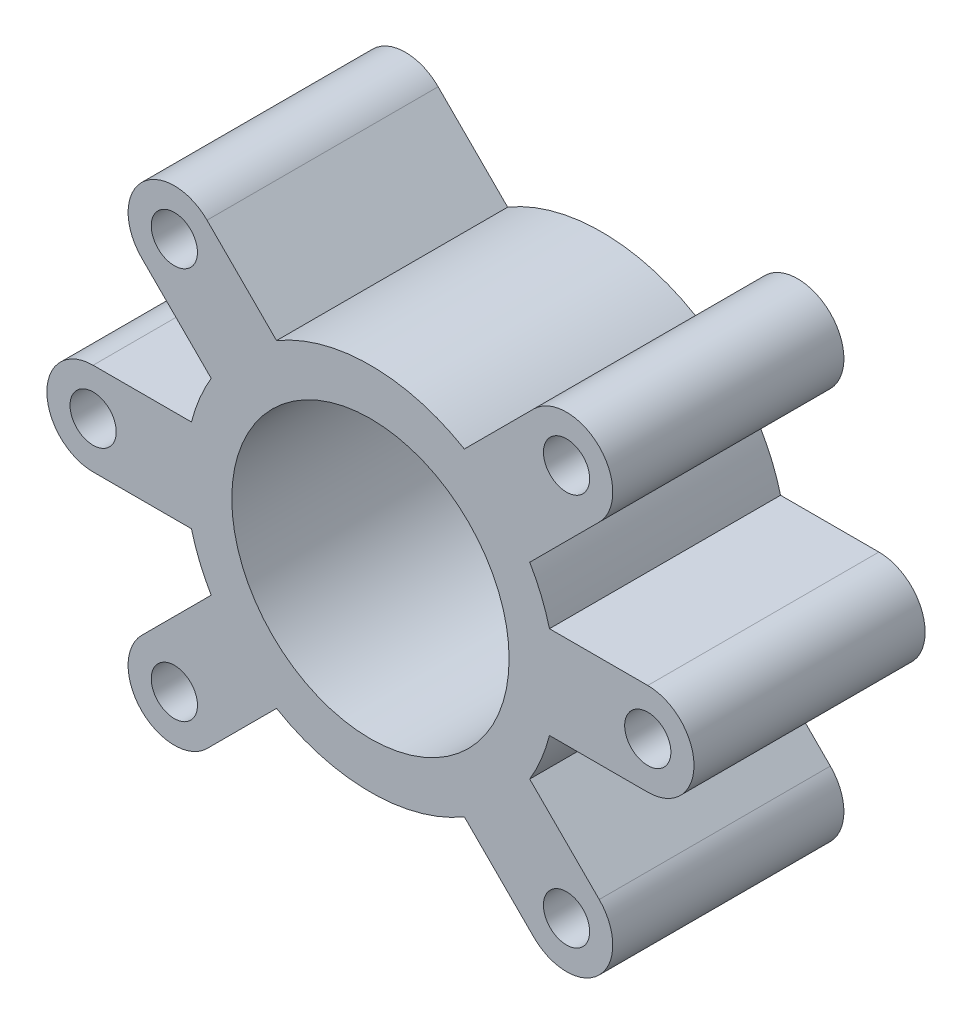
ISO-10303-21;
HEADER;
FILE_DESCRIPTION(('STEP AP214'),'2;1');
FILE_NAME('part.step','',(''),(''),'','','');
FILE_SCHEMA(('AUTOMOTIVE_DESIGN { 1 0 10303 214 1 1 1 1 }'));
ENDSEC;
DATA;
#1=APPLICATION_CONTEXT('core data for automotive mechanical design processes');
#2=APPLICATION_PROTOCOL_DEFINITION('international standard','automotive_design',2000,#1);
#3=PRODUCT_CONTEXT('',#1,'mechanical');
#4=PRODUCT('Part','Part','',(#3));
#5=PRODUCT_RELATED_PRODUCT_CATEGORY('part','',(#4));
#6=PRODUCT_DEFINITION_FORMATION('','',#4);
#7=PRODUCT_DEFINITION_CONTEXT('part definition',#1,'design');
#8=PRODUCT_DEFINITION('design','',#6,#7);
#9=PRODUCT_DEFINITION_SHAPE('','',#8);
#10=(LENGTH_UNIT() NAMED_UNIT(*) SI_UNIT(.MILLI.,.METRE.));
#11=(NAMED_UNIT(*) PLANE_ANGLE_UNIT() SI_UNIT($,.RADIAN.));
#12=(NAMED_UNIT(*) SI_UNIT($,.STERADIAN.) SOLID_ANGLE_UNIT());
#13=UNCERTAINTY_MEASURE_WITH_UNIT(LENGTH_MEASURE(1.E-05),#10,'distance_accuracy_value','');
#14=(GEOMETRIC_REPRESENTATION_CONTEXT(3) GLOBAL_UNCERTAINTY_ASSIGNED_CONTEXT((#13)) GLOBAL_UNIT_ASSIGNED_CONTEXT((#10,
#11,#12)) REPRESENTATION_CONTEXT('',''));
#15=CARTESIAN_POINT('',(0.,0.,0.));
#16=DIRECTION('',(0.,0.,1.));
#17=DIRECTION('',(1.,0.,0.));
#18=AXIS2_PLACEMENT_3D('',#15,#16,#17);
#19=CARTESIAN_POINT('',(0.,0.,50.));
#20=DIRECTION('',(0.,0.,-1.));
#21=DIRECTION('',(-1.,0.,0.));
#22=AXIS2_PLACEMENT_3D('',#19,#20,#21);
#23=CYLINDRICAL_SURFACE('',#22,40.);
#24=CARTESIAN_POINT('',(0.,0.,0.));
#25=DIRECTION('',(0.,0.,1.));
#26=DIRECTION('',(1.,0.,0.));
#27=AXIS2_PLACEMENT_3D('',#24,#25,#26);
#28=CIRCLE('',#27,40.);
#29=CARTESIAN_POINT('',(38.7298334620742,10.,0.));
#30=VERTEX_POINT('',#29);
#31=CARTESIAN_POINT('',(34.457195687124,20.3150600633924,0.));
#32=VERTEX_POINT('',#31);
#33=EDGE_CURVE('E251',#30,#32,#28,.T.);
#34=ORIENTED_EDGE('',*,*,#33,.T.);
#35=DIRECTION('',(0.,0.,-1.));
#36=VECTOR('',#35,1.);
#37=CARTESIAN_POINT('',(34.457195687124,20.3150600633924,50.));
#38=LINE('',#37,#36);
#39=CARTESIAN_POINT('',(34.457195687124,20.3150600633924,50.));
#40=VERTEX_POINT('',#39);
#41=EDGE_CURVE('E11',#40,#32,#38,.T.);
#42=ORIENTED_EDGE('',*,*,#41,.F.);
#43=CARTESIAN_POINT('',(0.,0.,50.));
#44=DIRECTION('',(0.,0.,1.));
#45=DIRECTION('',(1.,0.,0.));
#46=AXIS2_PLACEMENT_3D('',#43,#44,#45);
#47=CIRCLE('',#46,40.);
#48=CARTESIAN_POINT('',(38.7298334620742,10.,50.));
#49=VERTEX_POINT('',#48);
#50=EDGE_CURVE('E139',#49,#40,#47,.T.);
#51=ORIENTED_EDGE('',*,*,#50,.F.);
#52=DIRECTION('',(0.,0.,-1.));
#53=VECTOR('',#52,1.);
#54=CARTESIAN_POINT('',(38.7298334620742,10.,50.));
#55=LINE('',#54,#53);
#56=EDGE_CURVE('E54',#49,#30,#55,.T.);
#57=ORIENTED_EDGE('',*,*,#56,.T.);
#58=EDGE_LOOP('',(#34,#42,#51,#57));
#59=FACE_BOUND('',#58,.T.);
#60=ADVANCED_FACE('F37',(#59),#23,.T.);
#61=CARTESIAN_POINT('',(7.0710678118654,-7.07106781186557,50.));
#62=DIRECTION('',(0.707106781186539,-0.707106781186556,0.));
#63=DIRECTION('',(0.707106781186556,0.707106781186539,0.));
#64=AXIS2_PLACEMENT_3D('',#61,#62,#63);
#65=PLANE('',#64);
#66=DIRECTION('',(-0.707106781186556,-0.707106781186539,0.));
#67=VECTOR('',#66,1.);
#68=CARTESIAN_POINT('',(7.0710678118654,-7.07106781186557,0.));
#69=LINE('',#68,#67);
#70=CARTESIAN_POINT('',(49.4974746830588,35.3553390593268,0.));
#71=VERTEX_POINT('',#70);
#72=EDGE_CURVE('E253',#71,#32,#69,.T.);
#73=ORIENTED_EDGE('',*,*,#72,.F.);
#74=DIRECTION('',(0.,0.,-1.));
#75=VECTOR('',#74,1.);
#76=CARTESIAN_POINT('',(49.4974746830588,35.3553390593268,50.));
#77=LINE('',#76,#75);
#78=CARTESIAN_POINT('',(49.4974746830588,35.3553390593268,50.));
#79=VERTEX_POINT('',#78);
#80=EDGE_CURVE('E46',#79,#71,#77,.T.);
#81=ORIENTED_EDGE('',*,*,#80,.F.);
#82=DIRECTION('',(-0.707106781186556,-0.707106781186539,0.));
#83=VECTOR('',#82,1.);
#84=CARTESIAN_POINT('',(7.0710678118654,-7.07106781186557,50.));
#85=LINE('',#84,#83);
#86=EDGE_CURVE('E388',#79,#40,#85,.T.);
#87=ORIENTED_EDGE('',*,*,#86,.T.);
#88=ORIENTED_EDGE('',*,*,#41,.T.);
#89=EDGE_LOOP('',(#73,#81,#87,#88));
#90=FACE_BOUND('',#89,.T.);
#91=ADVANCED_FACE('F375',(#90),#65,.T.);
#92=CARTESIAN_POINT('',(42.4264068711934,42.4264068711923,50.));
#93=DIRECTION('',(0.,0.,-1.));
#94=DIRECTION('',(-1.,0.,0.));
#95=AXIS2_PLACEMENT_3D('',#92,#93,#94);
#96=CYLINDRICAL_SURFACE('',#95,10.);
#97=CARTESIAN_POINT('',(42.4264068711934,42.4264068711923,0.));
#98=DIRECTION('',(0.,0.,1.));
#99=DIRECTION('',(1.,0.,0.));
#100=AXIS2_PLACEMENT_3D('',#97,#98,#99);
#101=CIRCLE('',#100,10.);
#102=CARTESIAN_POINT('',(35.355339059328,49.4974746830579,0.));
#103=VERTEX_POINT('',#102);
#104=EDGE_CURVE('E258',#103,#71,#101,.F.);
#105=ORIENTED_EDGE('',*,*,#104,.F.);
#106=DIRECTION('',(0.,0.,-1.));
#107=VECTOR('',#106,1.);
#108=CARTESIAN_POINT('',(35.355339059328,49.4974746830579,50.));
#109=LINE('',#108,#107);
#110=CARTESIAN_POINT('',(35.355339059328,49.4974746830579,50.));
#111=VERTEX_POINT('',#110);
#112=EDGE_CURVE('E365',#111,#103,#109,.T.);
#113=ORIENTED_EDGE('',*,*,#112,.F.);
#114=CARTESIAN_POINT('',(42.4264068711934,42.4264068711923,50.));
#115=DIRECTION('',(0.,0.,1.));
#116=DIRECTION('',(1.,0.,0.));
#117=AXIS2_PLACEMENT_3D('',#114,#115,#116);
#118=CIRCLE('',#117,10.);
#119=EDGE_CURVE('E372',#111,#79,#118,.F.);
#120=ORIENTED_EDGE('',*,*,#119,.T.);
#121=ORIENTED_EDGE('',*,*,#80,.T.);
#122=EDGE_LOOP('',(#105,#113,#120,#121));
#123=FACE_BOUND('',#122,.T.);
#124=ADVANCED_FACE('F370',(#123),#96,.T.);
#125=CARTESIAN_POINT('',(-7.07106781186559,7.07106781186585,50.));
#126=DIRECTION('',(-0.707106781186535,0.70710678118656,0.));
#127=DIRECTION('',(-0.70710678118656,-0.707106781186535,0.));
#128=AXIS2_PLACEMENT_3D('',#125,#126,#127);
#129=PLANE('',#128);
#130=DIRECTION('',(0.70710678118656,0.707106781186535,0.));
#131=VECTOR('',#130,1.);
#132=CARTESIAN_POINT('',(-7.07106781186559,7.07106781186585,0.));
#133=LINE('',#132,#131);
#134=CARTESIAN_POINT('',(20.3150600633923,34.4571956871231,0.));
#135=VERTEX_POINT('',#134);
#136=EDGE_CURVE('E261',#135,#103,#133,.T.);
#137=ORIENTED_EDGE('',*,*,#136,.F.);
#138=DIRECTION('',(0.,0.,-1.));
#139=VECTOR('',#138,1.);
#140=CARTESIAN_POINT('',(20.3150600633923,34.4571956871231,50.));
#141=LINE('',#140,#139);
#142=CARTESIAN_POINT('',(20.3150600633923,34.4571956871231,50.));
#143=VERTEX_POINT('',#142);
#144=EDGE_CURVE('E363',#143,#135,#141,.T.);
#145=ORIENTED_EDGE('',*,*,#144,.F.);
#146=DIRECTION('',(0.70710678118656,0.707106781186535,0.));
#147=VECTOR('',#146,1.);
#148=CARTESIAN_POINT('',(-7.07106781186559,7.07106781186585,50.));
#149=LINE('',#148,#147);
#150=EDGE_CURVE('E387',#143,#111,#149,.T.);
#151=ORIENTED_EDGE('',*,*,#150,.T.);
#152=ORIENTED_EDGE('',*,*,#112,.T.);
#153=EDGE_LOOP('',(#137,#145,#151,#152));
#154=FACE_BOUND('',#153,.T.);
#155=ADVANCED_FACE('F383',(#154),#129,.T.);
#156=CARTESIAN_POINT('',(-20.315060063393,34.4571956871215,0.));
#157=VERTEX_POINT('',#156);
#158=EDGE_CURVE('E255',#135,#157,#28,.T.);
#159=ORIENTED_EDGE('',*,*,#158,.T.);
#160=DIRECTION('',(0.,0.,-1.));
#161=VECTOR('',#160,1.);
#162=CARTESIAN_POINT('',(-20.315060063393,34.4571956871215,50.));
#163=LINE('',#162,#161);
#164=CARTESIAN_POINT('',(-20.315060063393,34.4571956871215,50.));
#165=VERTEX_POINT('',#164);
#166=EDGE_CURVE('E361',#165,#157,#163,.T.);
#167=ORIENTED_EDGE('',*,*,#166,.F.);
#168=EDGE_CURVE('E390',#143,#165,#47,.T.);
#169=ORIENTED_EDGE('',*,*,#168,.F.);
#170=ORIENTED_EDGE('',*,*,#144,.T.);
#171=EDGE_LOOP('',(#159,#167,#169,#170));
#172=FACE_BOUND('',#171,.T.);
#173=ADVANCED_FACE('F483',(#172),#23,.T.);
#174=CARTESIAN_POINT('',(7.07106781186388,7.07106781186386,50.));
#175=DIRECTION('',(0.707106781186548,0.707106781186547,0.));
#176=DIRECTION('',(-0.707106781186547,0.707106781186548,0.));
#177=AXIS2_PLACEMENT_3D('',#174,#175,#176);
#178=PLANE('',#177);
#179=DIRECTION('',(0.707106781186547,-0.707106781186548,0.));
#180=VECTOR('',#179,1.);
#181=CARTESIAN_POINT('',(7.07106781186388,7.07106781186386,0.));
#182=LINE('',#181,#180);
#183=CARTESIAN_POINT('',(-35.3553390593272,49.4974746830551,0.));
#184=VERTEX_POINT('',#183);
#185=EDGE_CURVE('E264',#184,#157,#182,.T.);
#186=ORIENTED_EDGE('',*,*,#185,.F.);
#187=DIRECTION('',(0.,0.,-1.));
#188=VECTOR('',#187,1.);
#189=CARTESIAN_POINT('',(-35.3553390593272,49.4974746830551,50.));
#190=LINE('',#189,#188);
#191=CARTESIAN_POINT('',(-35.3553390593272,49.4974746830551,50.));
#192=VERTEX_POINT('',#191);
#193=EDGE_CURVE('E359',#192,#184,#190,.T.);
#194=ORIENTED_EDGE('',*,*,#193,.F.);
#195=DIRECTION('',(0.707106781186547,-0.707106781186548,0.));
#196=VECTOR('',#195,1.);
#197=CARTESIAN_POINT('',(7.07106781186388,7.07106781186386,50.));
#198=LINE('',#197,#196);
#199=EDGE_CURVE('E395',#192,#165,#198,.T.);
#200=ORIENTED_EDGE('',*,*,#199,.T.);
#201=ORIENTED_EDGE('',*,*,#166,.T.);
#202=EDGE_LOOP('',(#186,#194,#200,#201));
#203=FACE_BOUND('',#202,.T.);
#204=ADVANCED_FACE('F487',(#203),#178,.T.);
#205=CARTESIAN_POINT('',(-42.4264068711927,42.4264068711896,50.));
#206=DIRECTION('',(0.,0.,-1.));
#207=DIRECTION('',(-1.,0.,0.));
#208=AXIS2_PLACEMENT_3D('',#205,#206,#207);
#209=CYLINDRICAL_SURFACE('',#208,9.99999999999998);
#210=CARTESIAN_POINT('',(-42.4264068711927,42.4264068711896,0.));
#211=DIRECTION('',(0.,0.,1.));
#212=DIRECTION('',(1.,0.,0.));
#213=AXIS2_PLACEMENT_3D('',#210,#211,#212);
#214=CIRCLE('',#213,9.99999999999998);
#215=CARTESIAN_POINT('',(-49.4974746830582,35.3553390593242,0.));
#216=VERTEX_POINT('',#215);
#217=EDGE_CURVE('E267',#216,#184,#214,.F.);
#218=ORIENTED_EDGE('',*,*,#217,.F.);
#219=DIRECTION('',(0.,0.,-1.));
#220=VECTOR('',#219,1.);
#221=CARTESIAN_POINT('',(-49.4974746830582,35.3553390593242,50.));
#222=LINE('',#221,#220);
#223=CARTESIAN_POINT('',(-49.4974746830582,35.3553390593242,50.));
#224=VERTEX_POINT('',#223);
#225=EDGE_CURVE('E357',#224,#216,#222,.T.);
#226=ORIENTED_EDGE('',*,*,#225,.F.);
#227=CARTESIAN_POINT('',(-42.4264068711927,42.4264068711896,50.));
#228=DIRECTION('',(0.,0.,1.));
#229=DIRECTION('',(1.,0.,0.));
#230=AXIS2_PLACEMENT_3D('',#227,#228,#229);
#231=CIRCLE('',#230,9.99999999999998);
#232=EDGE_CURVE('E398',#224,#192,#231,.F.);
#233=ORIENTED_EDGE('',*,*,#232,.T.);
#234=ORIENTED_EDGE('',*,*,#193,.T.);
#235=EDGE_LOOP('',(#218,#226,#233,#234));
#236=FACE_BOUND('',#235,.T.);
#237=ADVANCED_FACE('F490',(#236),#209,.T.);
#238=CARTESIAN_POINT('',(-7.07106781186715,-7.07106781186711,50.));
#239=DIRECTION('',(-0.70710678118655,-0.707106781186545,0.));
#240=DIRECTION('',(0.707106781186545,-0.70710678118655,0.));
#241=AXIS2_PLACEMENT_3D('',#238,#239,#240);
#242=PLANE('',#241);
#243=DIRECTION('',(-0.707106781186545,0.70710678118655,0.));
#244=VECTOR('',#243,1.);
#245=CARTESIAN_POINT('',(-7.07106781186715,-7.07106781186711,0.));
#246=LINE('',#245,#244);
#247=CARTESIAN_POINT('',(-34.4571956871241,20.3150600633895,0.));
#248=VERTEX_POINT('',#247);
#249=EDGE_CURVE('E270',#248,#216,#246,.T.);
#250=ORIENTED_EDGE('',*,*,#249,.F.);
#251=DIRECTION('',(0.,0.,-1.));
#252=VECTOR('',#251,1.);
#253=CARTESIAN_POINT('',(-34.4571956871241,20.3150600633895,50.));
#254=LINE('',#253,#252);
#255=CARTESIAN_POINT('',(-34.4571956871241,20.3150600633895,50.));
#256=VERTEX_POINT('',#255);
#257=EDGE_CURVE('E355',#256,#248,#254,.T.);
#258=ORIENTED_EDGE('',*,*,#257,.F.);
#259=DIRECTION('',(-0.707106781186545,0.70710678118655,0.));
#260=VECTOR('',#259,1.);
#261=CARTESIAN_POINT('',(-7.07106781186715,-7.07106781186711,50.));
#262=LINE('',#261,#260);
#263=EDGE_CURVE('E401',#256,#224,#262,.T.);
#264=ORIENTED_EDGE('',*,*,#263,.T.);
#265=ORIENTED_EDGE('',*,*,#225,.T.);
#266=EDGE_LOOP('',(#250,#258,#264,#265));
#267=FACE_BOUND('',#266,.T.);
#268=ADVANCED_FACE('F493',(#267),#242,.T.);
#269=CARTESIAN_POINT('',(-38.7298334620733,9.99999999999677,0.));
#270=VERTEX_POINT('',#269);
#271=EDGE_CURVE('E273',#248,#270,#28,.T.);
#272=ORIENTED_EDGE('',*,*,#271,.T.);
#273=DIRECTION('',(0.,0.,-1.));
#274=VECTOR('',#273,1.);
#275=CARTESIAN_POINT('',(-38.7298334620733,9.99999999999677,50.));
#276=LINE('',#275,#274);
#277=CARTESIAN_POINT('',(-38.7298334620733,9.99999999999677,50.));
#278=VERTEX_POINT('',#277);
#279=EDGE_CURVE('E353',#278,#270,#276,.T.);
#280=ORIENTED_EDGE('',*,*,#279,.F.);
#281=EDGE_CURVE('E404',#256,#278,#47,.T.);
#282=ORIENTED_EDGE('',*,*,#281,.F.);
#283=ORIENTED_EDGE('',*,*,#257,.T.);
#284=EDGE_LOOP('',(#272,#280,#282,#283));
#285=FACE_BOUND('',#284,.T.);
#286=ADVANCED_FACE('F494',(#285),#23,.T.);
#287=CARTESIAN_POINT('',(0.,9.99999999999628,50.));
#288=DIRECTION('',(0.,1.,0.));
#289=DIRECTION('',(-1.,0.,0.));
#290=AXIS2_PLACEMENT_3D('',#287,#288,#289);
#291=PLANE('',#290);
#292=DIRECTION('',(1.,0.,0.));
#293=VECTOR('',#292,1.);
#294=CARTESIAN_POINT('',(0.,9.99999999999628,0.));
#295=LINE('',#294,#293);
#296=CARTESIAN_POINT('',(-59.9999999999985,9.99999999999639,0.));
#297=VERTEX_POINT('',#296);
#298=EDGE_CURVE('E274',#297,#270,#295,.T.);
#299=ORIENTED_EDGE('',*,*,#298,.F.);
#300=DIRECTION('',(0.,0.,-1.));
#301=VECTOR('',#300,1.);
#302=CARTESIAN_POINT('',(-59.9999999999985,9.99999999999639,50.));
#303=LINE('',#302,#301);
#304=CARTESIAN_POINT('',(-59.9999999999985,9.99999999999639,50.));
#305=VERTEX_POINT('',#304);
#306=EDGE_CURVE('E351',#305,#297,#303,.T.);
#307=ORIENTED_EDGE('',*,*,#306,.F.);
#308=DIRECTION('',(1.,0.,0.));
#309=VECTOR('',#308,1.);
#310=CARTESIAN_POINT('',(0.,9.99999999999628,50.));
#311=LINE('',#310,#309);
#312=EDGE_CURVE('E405',#305,#278,#311,.T.);
#313=ORIENTED_EDGE('',*,*,#312,.T.);
#314=ORIENTED_EDGE('',*,*,#279,.T.);
#315=EDGE_LOOP('',(#299,#307,#313,#314));
#316=FACE_BOUND('',#315,.T.);
#317=ADVANCED_FACE('F497',(#316),#291,.T.);
#318=CARTESIAN_POINT('',(-59.9999999999985,-3.60742125764109E-12,50.));
#319=DIRECTION('',(0.,0.,-1.));
#320=DIRECTION('',(-1.,0.,0.));
#321=AXIS2_PLACEMENT_3D('',#318,#319,#320);
#322=CYLINDRICAL_SURFACE('',#321,10.);
#323=CARTESIAN_POINT('',(-59.9999999999985,-3.60742125764109E-12,0.));
#324=DIRECTION('',(0.,0.,1.));
#325=DIRECTION('',(1.,0.,0.));
#326=AXIS2_PLACEMENT_3D('',#323,#324,#325);
#327=CIRCLE('',#326,10.);
#328=CARTESIAN_POINT('',(-59.9999999999985,-10.0000000000036,0.));
#329=VERTEX_POINT('',#328);
#330=EDGE_CURVE('E277',#329,#297,#327,.F.);
#331=ORIENTED_EDGE('',*,*,#330,.F.);
#332=DIRECTION('',(0.,0.,-1.));
#333=VECTOR('',#332,1.);
#334=CARTESIAN_POINT('',(-59.9999999999985,-10.0000000000036,50.));
#335=LINE('',#334,#333);
#336=CARTESIAN_POINT('',(-59.9999999999985,-10.0000000000036,50.));
#337=VERTEX_POINT('',#336);
#338=EDGE_CURVE('E349',#337,#329,#335,.T.);
#339=ORIENTED_EDGE('',*,*,#338,.F.);
#340=CARTESIAN_POINT('',(-59.9999999999985,-3.60742125764109E-12,50.));
#341=DIRECTION('',(0.,0.,1.));
#342=DIRECTION('',(1.,0.,0.));
#343=AXIS2_PLACEMENT_3D('',#340,#341,#342);
#344=CIRCLE('',#343,10.);
#345=EDGE_CURVE('E408',#337,#305,#344,.F.);
#346=ORIENTED_EDGE('',*,*,#345,.T.);
#347=ORIENTED_EDGE('',*,*,#306,.T.);
#348=EDGE_LOOP('',(#331,#339,#346,#347));
#349=FACE_BOUND('',#348,.T.);
#350=ADVANCED_FACE('F500',(#349),#322,.T.);
#351=CARTESIAN_POINT('',(0.,-10.0000000000037,50.));
#352=DIRECTION('',(0.,-1.,0.));
#353=DIRECTION('',(1.,0.,0.));
#354=AXIS2_PLACEMENT_3D('',#351,#352,#353);
#355=PLANE('',#354);
#356=DIRECTION('',(-1.,0.,0.));
#357=VECTOR('',#356,1.);
#358=CARTESIAN_POINT('',(0.,-10.0000000000037,0.));
#359=LINE('',#358,#357);
#360=CARTESIAN_POINT('',(-38.7298334620724,-10.0000000000038,0.));
#361=VERTEX_POINT('',#360);
#362=EDGE_CURVE('E280',#361,#329,#359,.T.);
#363=ORIENTED_EDGE('',*,*,#362,.F.);
#364=DIRECTION('',(0.,0.,-1.));
#365=VECTOR('',#364,1.);
#366=CARTESIAN_POINT('',(-38.7298334620724,-10.0000000000038,50.));
#367=LINE('',#366,#365);
#368=CARTESIAN_POINT('',(-38.7298334620724,-10.0000000000038,50.));
#369=VERTEX_POINT('',#368);
#370=EDGE_CURVE('E347',#369,#361,#367,.T.);
#371=ORIENTED_EDGE('',*,*,#370,.F.);
#372=DIRECTION('',(-1.,0.,0.));
#373=VECTOR('',#372,1.);
#374=CARTESIAN_POINT('',(0.,-10.0000000000037,50.));
#375=LINE('',#374,#373);
#376=EDGE_CURVE('E411',#369,#337,#375,.T.);
#377=ORIENTED_EDGE('',*,*,#376,.T.);
#378=ORIENTED_EDGE('',*,*,#338,.T.);
#379=EDGE_LOOP('',(#363,#371,#377,#378));
#380=FACE_BOUND('',#379,.T.);
#381=ADVANCED_FACE('F503',(#380),#355,.T.);
#382=CARTESIAN_POINT('',(-34.4571956871211,-20.3150600633955,0.));
#383=VERTEX_POINT('',#382);
#384=EDGE_CURVE('E283',#361,#383,#28,.T.);
#385=ORIENTED_EDGE('',*,*,#384,.T.);
#386=DIRECTION('',(0.,0.,-1.));
#387=VECTOR('',#386,1.);
#388=CARTESIAN_POINT('',(-34.4571956871211,-20.3150600633955,50.));
#389=LINE('',#388,#387);
#390=CARTESIAN_POINT('',(-34.4571956871211,-20.3150600633955,50.));
#391=VERTEX_POINT('',#390);
#392=EDGE_CURVE('E345',#391,#383,#389,.T.);
#393=ORIENTED_EDGE('',*,*,#392,.F.);
#394=EDGE_CURVE('E414',#369,#391,#47,.T.);
#395=ORIENTED_EDGE('',*,*,#394,.F.);
#396=ORIENTED_EDGE('',*,*,#370,.T.);
#397=EDGE_LOOP('',(#385,#393,#395,#396));
#398=FACE_BOUND('',#397,.T.);
#399=ADVANCED_FACE('F449',(#398),#23,.T.);
#400=CARTESIAN_POINT('',(-7.0710678118626,7.07106781186262,50.));
#401=DIRECTION('',(-0.707106781186547,0.707106781186549,0.));
#402=DIRECTION('',(-0.707106781186549,-0.707106781186547,0.));
#403=AXIS2_PLACEMENT_3D('',#400,#401,#402);
#404=PLANE('',#403);
#405=DIRECTION('',(0.707106781186549,0.707106781186546,0.));
#406=VECTOR('',#405,1.);
#407=CARTESIAN_POINT('',(-7.0710678118626,7.07106781186262,0.));
#408=LINE('',#407,#406);
#409=CARTESIAN_POINT('',(-49.4974746830557,-35.3553390593303,0.));
#410=VERTEX_POINT('',#409);
#411=EDGE_CURVE('E284',#410,#383,#408,.T.);
#412=ORIENTED_EDGE('',*,*,#411,.F.);
#413=DIRECTION('',(0.,0.,-1.));
#414=VECTOR('',#413,1.);
#415=CARTESIAN_POINT('',(-49.4974746830557,-35.3553390593303,50.));
#416=LINE('',#415,#414);
#417=CARTESIAN_POINT('',(-49.4974746830557,-35.3553390593303,50.));
#418=VERTEX_POINT('',#417);
#419=EDGE_CURVE('E343',#418,#410,#416,.T.);
#420=ORIENTED_EDGE('',*,*,#419,.F.);
#421=DIRECTION('',(0.707106781186549,0.707106781186546,0.));
#422=VECTOR('',#421,1.);
#423=CARTESIAN_POINT('',(-7.0710678118626,7.07106781186262,50.));
#424=LINE('',#423,#422);
#425=EDGE_CURVE('E415',#418,#391,#424,.T.);
#426=ORIENTED_EDGE('',*,*,#425,.T.);
#427=ORIENTED_EDGE('',*,*,#392,.T.);
#428=EDGE_LOOP('',(#412,#420,#426,#427));
#429=FACE_BOUND('',#428,.T.);
#430=ADVANCED_FACE('F453',(#429),#404,.T.);
#431=CARTESIAN_POINT('',(-42.4264068711902,-42.4264068711958,50.));
#432=DIRECTION('',(0.,0.,-1.));
#433=DIRECTION('',(-1.,0.,0.));
#434=AXIS2_PLACEMENT_3D('',#431,#432,#433);
#435=CYLINDRICAL_SURFACE('',#434,9.99999999999998);
#436=CARTESIAN_POINT('',(-42.4264068711902,-42.4264068711958,0.));
#437=DIRECTION('',(0.,0.,1.));
#438=DIRECTION('',(1.,0.,0.));
#439=AXIS2_PLACEMENT_3D('',#436,#437,#438);
#440=CIRCLE('',#439,9.99999999999998);
#441=CARTESIAN_POINT('',(-35.3553390593247,-49.4974746830612,0.));
#442=VERTEX_POINT('',#441);
#443=EDGE_CURVE('E287',#442,#410,#440,.F.);
#444=ORIENTED_EDGE('',*,*,#443,.F.);
#445=DIRECTION('',(0.,0.,-1.));
#446=VECTOR('',#445,1.);
#447=CARTESIAN_POINT('',(-35.3553390593247,-49.4974746830612,50.));
#448=LINE('',#447,#446);
#449=CARTESIAN_POINT('',(-35.3553390593247,-49.4974746830612,50.));
#450=VERTEX_POINT('',#449);
#451=EDGE_CURVE('E341',#450,#442,#448,.T.);
#452=ORIENTED_EDGE('',*,*,#451,.F.);
#453=CARTESIAN_POINT('',(-42.4264068711902,-42.4264068711958,50.));
#454=DIRECTION('',(0.,0.,1.));
#455=DIRECTION('',(1.,0.,0.));
#456=AXIS2_PLACEMENT_3D('',#453,#454,#455);
#457=CIRCLE('',#456,9.99999999999998);
#458=EDGE_CURVE('E418',#450,#418,#457,.F.);
#459=ORIENTED_EDGE('',*,*,#458,.T.);
#460=ORIENTED_EDGE('',*,*,#419,.T.);
#461=EDGE_LOOP('',(#444,#452,#459,#460));
#462=FACE_BOUND('',#461,.T.);
#463=ADVANCED_FACE('F456',(#462),#435,.T.);
#464=CARTESIAN_POINT('',(7.07106781186836,-7.07106781186841,50.));
#465=DIRECTION('',(0.707106781186545,-0.70710678118655,0.));
#466=DIRECTION('',(0.70710678118655,0.707106781186545,0.));
#467=AXIS2_PLACEMENT_3D('',#464,#465,#466);
#468=PLANE('',#467);
#469=DIRECTION('',(-0.70710678118655,-0.707106781186545,0.));
#470=VECTOR('',#469,1.);
#471=CARTESIAN_POINT('',(7.07106781186836,-7.07106781186841,0.));
#472=LINE('',#471,#470);
#473=CARTESIAN_POINT('',(-20.3150600633894,-34.4571956871259,0.));
#474=VERTEX_POINT('',#473);
#475=EDGE_CURVE('E290',#474,#442,#472,.T.);
#476=ORIENTED_EDGE('',*,*,#475,.F.);
#477=DIRECTION('',(0.,0.,-1.));
#478=VECTOR('',#477,1.);
#479=CARTESIAN_POINT('',(-20.3150600633894,-34.4571956871259,50.));
#480=LINE('',#479,#478);
#481=CARTESIAN_POINT('',(-20.3150600633894,-34.4571956871259,50.));
#482=VERTEX_POINT('',#481);
#483=EDGE_CURVE('E339',#482,#474,#480,.T.);
#484=ORIENTED_EDGE('',*,*,#483,.F.);
#485=DIRECTION('',(-0.70710678118655,-0.707106781186545,0.));
#486=VECTOR('',#485,1.);
#487=CARTESIAN_POINT('',(7.07106781186836,-7.07106781186841,50.));
#488=LINE('',#487,#486);
#489=EDGE_CURVE('E421',#482,#450,#488,.T.);
#490=ORIENTED_EDGE('',*,*,#489,.T.);
#491=ORIENTED_EDGE('',*,*,#451,.T.);
#492=EDGE_LOOP('',(#476,#484,#490,#491));
#493=FACE_BOUND('',#492,.T.);
#494=ADVANCED_FACE('F460',(#493),#468,.T.);
#495=CARTESIAN_POINT('',(20.3150600633943,-34.4571956871232,0.));
#496=VERTEX_POINT('',#495);
#497=EDGE_CURVE('E293',#474,#496,#28,.T.);
#498=ORIENTED_EDGE('',*,*,#497,.T.);
#499=DIRECTION('',(0.,0.,-1.));
#500=VECTOR('',#499,1.);
#501=CARTESIAN_POINT('',(20.3150600633943,-34.4571956871232,50.));
#502=LINE('',#501,#500);
#503=CARTESIAN_POINT('',(20.3150600633943,-34.4571956871232,50.));
#504=VERTEX_POINT('',#503);
#505=EDGE_CURVE('E337',#504,#496,#502,.T.);
#506=ORIENTED_EDGE('',*,*,#505,.F.);
#507=EDGE_CURVE('E424',#482,#504,#47,.T.);
#508=ORIENTED_EDGE('',*,*,#507,.F.);
#509=ORIENTED_EDGE('',*,*,#483,.T.);
#510=EDGE_LOOP('',(#498,#506,#508,#509));
#511=FACE_BOUND('',#510,.T.);
#512=ADVANCED_FACE('F466',(#511),#23,.T.);
#513=CARTESIAN_POINT('',(-7.07106781186441,-7.07106781186436,50.));
#514=DIRECTION('',(-0.70710678118655,-0.707106781186545,0.));
#515=DIRECTION('',(0.707106781186545,-0.70710678118655,0.));
#516=AXIS2_PLACEMENT_3D('',#513,#514,#515);
#517=PLANE('',#516);
#518=DIRECTION('',(-0.707106781186545,0.70710678118655,0.));
#519=VECTOR('',#518,1.);
#520=CARTESIAN_POINT('',(-7.07106781186441,-7.07106781186436,0.));
#521=LINE('',#520,#519);
#522=CARTESIAN_POINT('',(35.3553390593297,-49.4974746830587,0.));
#523=VERTEX_POINT('',#522);
#524=EDGE_CURVE('E294',#523,#496,#521,.T.);
#525=ORIENTED_EDGE('',*,*,#524,.F.);
#526=DIRECTION('',(0.,0.,-1.));
#527=VECTOR('',#526,1.);
#528=CARTESIAN_POINT('',(35.3553390593297,-49.4974746830587,50.));
#529=LINE('',#528,#527);
#530=CARTESIAN_POINT('',(35.3553390593297,-49.4974746830587,50.));
#531=VERTEX_POINT('',#530);
#532=EDGE_CURVE('E335',#531,#523,#529,.T.);
#533=ORIENTED_EDGE('',*,*,#532,.F.);
#534=DIRECTION('',(-0.707106781186545,0.70710678118655,0.));
#535=VECTOR('',#534,1.);
#536=CARTESIAN_POINT('',(-7.07106781186441,-7.07106781186436,50.));
#537=LINE('',#536,#535);
#538=EDGE_CURVE('E425',#531,#504,#537,.T.);
#539=ORIENTED_EDGE('',*,*,#538,.T.);
#540=ORIENTED_EDGE('',*,*,#505,.T.);
#541=EDGE_LOOP('',(#525,#533,#539,#540));
#542=FACE_BOUND('',#541,.T.);
#543=ADVANCED_FACE('F504',(#542),#517,.T.);
#544=CARTESIAN_POINT('',(42.4264068711952,-42.4264068711932,50.));
#545=DIRECTION('',(0.,0.,-1.));
#546=DIRECTION('',(-1.,0.,0.));
#547=AXIS2_PLACEMENT_3D('',#544,#545,#546);
#548=CYLINDRICAL_SURFACE('',#547,10.);
#549=CARTESIAN_POINT('',(42.4264068711952,-42.4264068711932,0.));
#550=DIRECTION('',(0.,0.,1.));
#551=DIRECTION('',(1.,0.,0.));
#552=AXIS2_PLACEMENT_3D('',#549,#550,#551);
#553=CIRCLE('',#552,10.);
#554=CARTESIAN_POINT('',(49.4974746830607,-35.3553390593278,0.));
#555=VERTEX_POINT('',#554);
#556=EDGE_CURVE('E297',#555,#523,#553,.F.);
#557=ORIENTED_EDGE('',*,*,#556,.F.);
#558=DIRECTION('',(0.,0.,-1.));
#559=VECTOR('',#558,1.);
#560=CARTESIAN_POINT('',(49.4974746830607,-35.3553390593278,50.));
#561=LINE('',#560,#559);
#562=CARTESIAN_POINT('',(49.4974746830607,-35.3553390593278,50.));
#563=VERTEX_POINT('',#562);
#564=EDGE_CURVE('E333',#563,#555,#561,.T.);
#565=ORIENTED_EDGE('',*,*,#564,.F.);
#566=CARTESIAN_POINT('',(42.4264068711952,-42.4264068711932,50.));
#567=DIRECTION('',(0.,0.,1.));
#568=DIRECTION('',(1.,0.,0.));
#569=AXIS2_PLACEMENT_3D('',#566,#567,#568);
#570=CIRCLE('',#569,10.);
#571=EDGE_CURVE('E428',#563,#531,#570,.F.);
#572=ORIENTED_EDGE('',*,*,#571,.T.);
#573=ORIENTED_EDGE('',*,*,#532,.T.);
#574=EDGE_LOOP('',(#557,#565,#572,#573));
#575=FACE_BOUND('',#574,.T.);
#576=ADVANCED_FACE('F472',(#575),#548,.T.);
#577=CARTESIAN_POINT('',(7.07106781186659,7.07106781186655,50.));
#578=DIRECTION('',(0.70710678118655,0.707106781186545,0.));
#579=DIRECTION('',(-0.707106781186545,0.70710678118655,0.));
#580=AXIS2_PLACEMENT_3D('',#577,#578,#579);
#581=PLANE('',#580);
#582=DIRECTION('',(0.707106781186545,-0.70710678118655,0.));
#583=VECTOR('',#582,1.);
#584=CARTESIAN_POINT('',(7.07106781186659,7.07106781186655,0.));
#585=LINE('',#584,#583);
#586=CARTESIAN_POINT('',(34.4571956871249,-20.3150600633922,0.));
#587=VERTEX_POINT('',#586);
#588=EDGE_CURVE('E300',#587,#555,#585,.T.);
#589=ORIENTED_EDGE('',*,*,#588,.F.);
#590=DIRECTION('',(0.,0.,-1.));
#591=VECTOR('',#590,1.);
#592=CARTESIAN_POINT('',(34.4571956871249,-20.3150600633922,50.));
#593=LINE('',#592,#591);
#594=CARTESIAN_POINT('',(34.4571956871249,-20.3150600633922,50.));
#595=VERTEX_POINT('',#594);
#596=EDGE_CURVE('E331',#595,#587,#593,.T.);
#597=ORIENTED_EDGE('',*,*,#596,.F.);
#598=DIRECTION('',(0.707106781186545,-0.70710678118655,0.));
#599=VECTOR('',#598,1.);
#600=CARTESIAN_POINT('',(7.07106781186659,7.07106781186655,50.));
#601=LINE('',#600,#599);
#602=EDGE_CURVE('E430',#595,#563,#601,.T.);
#603=ORIENTED_EDGE('',*,*,#602,.T.);
#604=ORIENTED_EDGE('',*,*,#564,.T.);
#605=EDGE_LOOP('',(#589,#597,#603,#604));
#606=FACE_BOUND('',#605,.T.);
#607=ADVANCED_FACE('F475',(#606),#581,.T.);
#608=CARTESIAN_POINT('',(38.7298334620742,-10.,0.));
#609=VERTEX_POINT('',#608);
#610=EDGE_CURVE('E254',#587,#609,#28,.T.);
#611=ORIENTED_EDGE('',*,*,#610,.T.);
#612=DIRECTION('',(0.,0.,-1.));
#613=VECTOR('',#612,1.);
#614=CARTESIAN_POINT('',(38.7298334620742,-10.,50.));
#615=LINE('',#614,#613);
#616=CARTESIAN_POINT('',(38.7298334620742,-10.,50.));
#617=VERTEX_POINT('',#616);
#618=EDGE_CURVE('E213',#617,#609,#615,.T.);
#619=ORIENTED_EDGE('',*,*,#618,.F.);
#620=EDGE_CURVE('E221',#595,#617,#47,.T.);
#621=ORIENTED_EDGE('',*,*,#620,.F.);
#622=ORIENTED_EDGE('',*,*,#596,.T.);
#623=EDGE_LOOP('',(#611,#619,#621,#622));
#624=FACE_BOUND('',#623,.T.);
#625=ADVANCED_FACE('F513',(#624),#23,.T.);
#626=CARTESIAN_POINT('',(0.,-10.,50.));
#627=DIRECTION('',(0.,-1.,0.));
#628=DIRECTION('',(1.,0.,0.));
#629=AXIS2_PLACEMENT_3D('',#626,#627,#628);
#630=PLANE('',#629);
#631=DIRECTION('',(-1.,0.,0.));
#632=VECTOR('',#631,1.);
#633=CARTESIAN_POINT('',(0.,-10.,0.));
#634=LINE('',#633,#632);
#635=CARTESIAN_POINT('',(60.,-10.,0.));
#636=VERTEX_POINT('',#635);
#637=EDGE_CURVE('E209',#636,#609,#634,.T.);
#638=ORIENTED_EDGE('',*,*,#637,.F.);
#639=DIRECTION('',(0.,0.,-1.));
#640=VECTOR('',#639,1.);
#641=CARTESIAN_POINT('',(60.,-10.,50.));
#642=LINE('',#641,#640);
#643=CARTESIAN_POINT('',(60.,-10.,50.));
#644=VERTEX_POINT('',#643);
#645=EDGE_CURVE('E204',#644,#636,#642,.T.);
#646=ORIENTED_EDGE('',*,*,#645,.F.);
#647=DIRECTION('',(-1.,0.,0.));
#648=VECTOR('',#647,1.);
#649=CARTESIAN_POINT('',(0.,-10.,50.));
#650=LINE('',#649,#648);
#651=EDGE_CURVE('E207',#644,#617,#650,.T.);
#652=ORIENTED_EDGE('',*,*,#651,.T.);
#653=ORIENTED_EDGE('',*,*,#618,.T.);
#654=EDGE_LOOP('',(#638,#646,#652,#653));
#655=FACE_BOUND('',#654,.T.);
#656=ADVANCED_FACE('F206',(#655),#630,.T.);
#657=CARTESIAN_POINT('',(60.,0.,50.));
#658=DIRECTION('',(0.,0.,-1.));
#659=DIRECTION('',(-1.,0.,0.));
#660=AXIS2_PLACEMENT_3D('',#657,#658,#659);
#661=CYLINDRICAL_SURFACE('',#660,10.);
#662=CARTESIAN_POINT('',(60.,0.,0.));
#663=DIRECTION('',(0.,0.,1.));
#664=DIRECTION('',(1.,0.,0.));
#665=AXIS2_PLACEMENT_3D('',#662,#663,#664);
#666=CIRCLE('',#665,10.);
#667=CARTESIAN_POINT('',(60.,10.,0.));
#668=VERTEX_POINT('',#667);
#669=EDGE_CURVE('E304',#668,#636,#666,.F.);
#670=ORIENTED_EDGE('',*,*,#669,.F.);
#671=DIRECTION('',(0.,0.,-1.));
#672=VECTOR('',#671,1.);
#673=CARTESIAN_POINT('',(60.,10.,50.));
#674=LINE('',#673,#672);
#675=CARTESIAN_POINT('',(60.,10.,50.));
#676=VERTEX_POINT('',#675);
#677=EDGE_CURVE('E127',#676,#668,#674,.T.);
#678=ORIENTED_EDGE('',*,*,#677,.F.);
#679=CARTESIAN_POINT('',(60.,0.,50.));
#680=DIRECTION('',(0.,0.,1.));
#681=DIRECTION('',(1.,0.,0.));
#682=AXIS2_PLACEMENT_3D('',#679,#680,#681);
#683=CIRCLE('',#682,10.);
#684=EDGE_CURVE('E218',#676,#644,#683,.F.);
#685=ORIENTED_EDGE('',*,*,#684,.T.);
#686=ORIENTED_EDGE('',*,*,#645,.T.);
#687=EDGE_LOOP('',(#670,#678,#685,#686));
#688=FACE_BOUND('',#687,.T.);
#689=ADVANCED_FACE('F224',(#688),#661,.T.);
#690=CARTESIAN_POINT('',(42.4264068711934,42.4264068711923,50.));
#691=DIRECTION('',(0.,0.,-1.));
#692=DIRECTION('',(-1.,0.,0.));
#693=AXIS2_PLACEMENT_3D('',#690,#691,#692);
#694=CYLINDRICAL_SURFACE('',#693,4.99999999999998);
#695=CARTESIAN_POINT('',(42.4264068711934,42.4264068711923,50.));
#696=DIRECTION('',(0.,0.,1.));
#697=DIRECTION('',(1.,0.,0.));
#698=AXIS2_PLACEMENT_3D('',#695,#696,#697);
#699=CIRCLE('',#698,4.99999999999998);
#700=CARTESIAN_POINT('',(47.4264068711934,42.4264068711923,50.));
#701=VERTEX_POINT('',#700);
#702=EDGE_CURVE('E242',#701,#701,#699,.T.);
#703=ORIENTED_EDGE('',*,*,#702,.T.);
#704=EDGE_LOOP('',(#703));
#705=FACE_BOUND('',#704,.T.);
#706=CARTESIAN_POINT('',(42.4264068711934,42.4264068711923,0.));
#707=DIRECTION('',(0.,0.,1.));
#708=DIRECTION('',(1.,0.,0.));
#709=AXIS2_PLACEMENT_3D('',#706,#707,#708);
#710=CIRCLE('',#709,4.99999999999998);
#711=CARTESIAN_POINT('',(47.4264068711934,42.4264068711923,0.));
#712=VERTEX_POINT('',#711);
#713=EDGE_CURVE('E321',#712,#712,#710,.T.);
#714=ORIENTED_EDGE('',*,*,#713,.F.);
#715=EDGE_LOOP('',(#714));
#716=FACE_BOUND('',#715,.T.);
#717=ADVANCED_FACE('F722',(#705,#716),#694,.F.);
#718=CARTESIAN_POINT('',(-42.4264068711927,42.4264068711896,50.));
#719=DIRECTION('',(0.,0.,-1.));
#720=DIRECTION('',(-1.,0.,0.));
#721=AXIS2_PLACEMENT_3D('',#718,#719,#720);
#722=CYLINDRICAL_SURFACE('',#721,5.00000000000146);
#723=CARTESIAN_POINT('',(-42.4264068711927,42.4264068711896,50.));
#724=DIRECTION('',(0.,0.,1.));
#725=DIRECTION('',(1.,0.,0.));
#726=AXIS2_PLACEMENT_3D('',#723,#724,#725);
#727=CIRCLE('',#726,5.00000000000146);
#728=CARTESIAN_POINT('',(-37.4264068711913,42.4264068711896,50.));
#729=VERTEX_POINT('',#728);
#730=EDGE_CURVE('E239',#729,#729,#727,.T.);
#731=ORIENTED_EDGE('',*,*,#730,.T.);
#732=EDGE_LOOP('',(#731));
#733=FACE_BOUND('',#732,.T.);
#734=CARTESIAN_POINT('',(-42.4264068711927,42.4264068711896,0.));
#735=DIRECTION('',(0.,0.,1.));
#736=DIRECTION('',(1.,0.,0.));
#737=AXIS2_PLACEMENT_3D('',#734,#735,#736);
#738=CIRCLE('',#737,5.00000000000146);
#739=CARTESIAN_POINT('',(-37.4264068711913,42.4264068711896,0.));
#740=VERTEX_POINT('',#739);
#741=EDGE_CURVE('E318',#740,#740,#738,.T.);
#742=ORIENTED_EDGE('',*,*,#741,.F.);
#743=EDGE_LOOP('',(#742));
#744=FACE_BOUND('',#743,.T.);
#745=ADVANCED_FACE('F731',(#733,#744),#722,.F.);
#746=CARTESIAN_POINT('',(-59.9999999999985,-3.60742125764109E-12,50.));
#747=DIRECTION('',(0.,0.,-1.));
#748=DIRECTION('',(-1.,0.,0.));
#749=AXIS2_PLACEMENT_3D('',#746,#747,#748);
#750=CYLINDRICAL_SURFACE('',#749,5.00000000000022);
#751=CARTESIAN_POINT('',(-59.9999999999985,-3.60742125764109E-12,50.));
#752=DIRECTION('',(0.,0.,1.));
#753=DIRECTION('',(1.,0.,0.));
#754=AXIS2_PLACEMENT_3D('',#751,#752,#753);
#755=CIRCLE('',#754,5.00000000000022);
#756=CARTESIAN_POINT('',(-54.9999999999983,-3.60742125764109E-12,50.));
#757=VERTEX_POINT('',#756);
#758=EDGE_CURVE('E236',#757,#757,#755,.T.);
#759=ORIENTED_EDGE('',*,*,#758,.T.);
#760=EDGE_LOOP('',(#759));
#761=FACE_BOUND('',#760,.T.);
#762=CARTESIAN_POINT('',(-59.9999999999985,-3.60742125764109E-12,0.));
#763=DIRECTION('',(0.,0.,1.));
#764=DIRECTION('',(1.,0.,0.));
#765=AXIS2_PLACEMENT_3D('',#762,#763,#764);
#766=CIRCLE('',#765,5.00000000000022);
#767=CARTESIAN_POINT('',(-54.9999999999983,-3.60742125764109E-12,0.));
#768=VERTEX_POINT('',#767);
#769=EDGE_CURVE('E315',#768,#768,#766,.T.);
#770=ORIENTED_EDGE('',*,*,#769,.F.);
#771=EDGE_LOOP('',(#770));
#772=FACE_BOUND('',#771,.T.);
#773=ADVANCED_FACE('F741',(#761,#772),#750,.F.);
#774=CARTESIAN_POINT('',(-42.4264068711902,-42.4264068711958,50.));
#775=DIRECTION('',(0.,0.,-1.));
#776=DIRECTION('',(-1.,0.,0.));
#777=AXIS2_PLACEMENT_3D('',#774,#775,#776);
#778=CYLINDRICAL_SURFACE('',#777,4.99999999999854);
#779=CARTESIAN_POINT('',(-42.4264068711902,-42.4264068711958,50.));
#780=DIRECTION('',(0.,0.,1.));
#781=DIRECTION('',(1.,0.,0.));
#782=AXIS2_PLACEMENT_3D('',#779,#780,#781);
#783=CIRCLE('',#782,4.99999999999854);
#784=CARTESIAN_POINT('',(-37.4264068711916,-42.4264068711958,50.));
#785=VERTEX_POINT('',#784);
#786=EDGE_CURVE('E233',#785,#785,#783,.T.);
#787=ORIENTED_EDGE('',*,*,#786,.T.);
#788=EDGE_LOOP('',(#787));
#789=FACE_BOUND('',#788,.T.);
#790=CARTESIAN_POINT('',(-42.4264068711902,-42.4264068711958,0.));
#791=DIRECTION('',(0.,0.,1.));
#792=DIRECTION('',(1.,0.,0.));
#793=AXIS2_PLACEMENT_3D('',#790,#791,#792);
#794=CIRCLE('',#793,4.99999999999854);
#795=CARTESIAN_POINT('',(-37.4264068711916,-42.4264068711958,0.));
#796=VERTEX_POINT('',#795);
#797=EDGE_CURVE('E312',#796,#796,#794,.T.);
#798=ORIENTED_EDGE('',*,*,#797,.F.);
#799=EDGE_LOOP('',(#798));
#800=FACE_BOUND('',#799,.T.);
#801=ADVANCED_FACE('F751',(#789,#800),#778,.F.);
#802=CARTESIAN_POINT('',(42.4264068711952,-42.4264068711932,50.));
#803=DIRECTION('',(0.,0.,-1.));
#804=DIRECTION('',(-1.,0.,0.));
#805=AXIS2_PLACEMENT_3D('',#802,#803,#804);
#806=CYLINDRICAL_SURFACE('',#805,4.99999999999766);
#807=CARTESIAN_POINT('',(42.4264068711952,-42.4264068711932,50.));
#808=DIRECTION('',(0.,0.,1.));
#809=DIRECTION('',(1.,0.,0.));
#810=AXIS2_PLACEMENT_3D('',#807,#808,#809);
#811=CIRCLE('',#810,4.99999999999766);
#812=CARTESIAN_POINT('',(47.4264068711929,-42.4264068711932,50.));
#813=VERTEX_POINT('',#812);
#814=EDGE_CURVE('E227',#813,#813,#811,.T.);
#815=ORIENTED_EDGE('',*,*,#814,.T.);
#816=EDGE_LOOP('',(#815));
#817=FACE_BOUND('',#816,.T.);
#818=CARTESIAN_POINT('',(42.4264068711952,-42.4264068711932,0.));
#819=DIRECTION('',(0.,0.,1.));
#820=DIRECTION('',(1.,0.,0.));
#821=AXIS2_PLACEMENT_3D('',#818,#819,#820);
#822=CIRCLE('',#821,4.99999999999766);
#823=CARTESIAN_POINT('',(47.4264068711929,-42.4264068711932,0.));
#824=VERTEX_POINT('',#823);
#825=EDGE_CURVE('E309',#824,#824,#822,.T.);
#826=ORIENTED_EDGE('',*,*,#825,.F.);
#827=EDGE_LOOP('',(#826));
#828=FACE_BOUND('',#827,.T.);
#829=ADVANCED_FACE('F761',(#817,#828),#806,.F.);
#830=CARTESIAN_POINT('',(0.,10.,50.));
#831=DIRECTION('',(0.,1.,0.));
#832=DIRECTION('',(0.,0.,1.));
#833=AXIS2_PLACEMENT_3D('',#830,#831,#832);
#834=PLANE('',#833);
#835=DIRECTION('',(1.,0.,0.));
#836=VECTOR('',#835,1.);
#837=CARTESIAN_POINT('',(0.,10.,0.));
#838=LINE('',#837,#836);
#839=EDGE_CURVE('E306',#30,#668,#838,.T.);
#840=ORIENTED_EDGE('',*,*,#839,.F.);
#841=ORIENTED_EDGE('',*,*,#56,.F.);
#842=DIRECTION('',(1.,0.,0.));
#843=VECTOR('',#842,1.);
#844=CARTESIAN_POINT('',(0.,10.,50.));
#845=LINE('',#844,#843);
#846=EDGE_CURVE('E225',#49,#676,#845,.T.);
#847=ORIENTED_EDGE('',*,*,#846,.T.);
#848=ORIENTED_EDGE('',*,*,#677,.T.);
#849=EDGE_LOOP('',(#840,#841,#847,#848));
#850=FACE_BOUND('',#849,.T.);
#851=ADVANCED_FACE('F771',(#850),#834,.T.);
#852=CARTESIAN_POINT('',(0.,0.,50.));
#853=DIRECTION('',(0.,0.,-1.));
#854=DIRECTION('',(-1.,0.,0.));
#855=AXIS2_PLACEMENT_3D('',#852,#853,#854);
#856=CYLINDRICAL_SURFACE('',#855,30.);
#857=CARTESIAN_POINT('',(0.,0.,50.));
#858=DIRECTION('',(0.,0.,1.));
#859=DIRECTION('',(1.,0.,0.));
#860=AXIS2_PLACEMENT_3D('',#857,#858,#859);
#861=CIRCLE('',#860,30.);
#862=CARTESIAN_POINT('',(30.,0.,50.));
#863=VERTEX_POINT('',#862);
#864=EDGE_CURVE('E327',#863,#863,#861,.T.);
#865=ORIENTED_EDGE('',*,*,#864,.T.);
#866=EDGE_LOOP('',(#865));
#867=FACE_BOUND('',#866,.T.);
#868=CARTESIAN_POINT('',(0.,0.,0.));
#869=DIRECTION('',(0.,0.,1.));
#870=DIRECTION('',(1.,0.,0.));
#871=AXIS2_PLACEMENT_3D('',#868,#869,#870);
#872=CIRCLE('',#871,30.);
#873=CARTESIAN_POINT('',(30.,0.,0.));
#874=VERTEX_POINT('',#873);
#875=EDGE_CURVE('E248',#874,#874,#872,.T.);
#876=ORIENTED_EDGE('',*,*,#875,.F.);
#877=EDGE_LOOP('',(#876));
#878=FACE_BOUND('',#877,.T.);
#879=ADVANCED_FACE('F39',(#867,#878),#856,.F.);
#880=CARTESIAN_POINT('',(60.,0.,50.));
#881=DIRECTION('',(0.,0.,-1.));
#882=DIRECTION('',(-1.,0.,0.));
#883=AXIS2_PLACEMENT_3D('',#880,#881,#882);
#884=CYLINDRICAL_SURFACE('',#883,4.99999999999999);
#885=CARTESIAN_POINT('',(60.,0.,50.));
#886=DIRECTION('',(0.,0.,1.));
#887=DIRECTION('',(1.,0.,0.));
#888=AXIS2_PLACEMENT_3D('',#885,#886,#887);
#889=CIRCLE('',#888,4.99999999999999);
#890=CARTESIAN_POINT('',(65.,0.,50.));
#891=VERTEX_POINT('',#890);
#892=EDGE_CURVE('E245',#891,#891,#889,.T.);
#893=ORIENTED_EDGE('',*,*,#892,.T.);
#894=EDGE_LOOP('',(#893));
#895=FACE_BOUND('',#894,.T.);
#896=CARTESIAN_POINT('',(60.,0.,0.));
#897=DIRECTION('',(0.,0.,1.));
#898=DIRECTION('',(1.,0.,0.));
#899=AXIS2_PLACEMENT_3D('',#896,#897,#898);
#900=CIRCLE('',#899,4.99999999999999);
#901=CARTESIAN_POINT('',(65.,0.,0.));
#902=VERTEX_POINT('',#901);
#903=EDGE_CURVE('E324',#902,#902,#900,.T.);
#904=ORIENTED_EDGE('',*,*,#903,.F.);
#905=EDGE_LOOP('',(#904));
#906=FACE_BOUND('',#905,.T.);
#907=ADVANCED_FACE('F789',(#895,#906),#884,.F.);
#908=CARTESIAN_POINT('',(0.,0.,50.));
#909=DIRECTION('',(0.,0.,1.));
#910=DIRECTION('',(1.,0.,0.));
#911=AXIS2_PLACEMENT_3D('',#908,#909,#910);
#912=PLANE('',#911);
#913=ORIENTED_EDGE('',*,*,#864,.F.);
#914=EDGE_LOOP('',(#913));
#915=FACE_BOUND('',#914,.T.);
#916=ORIENTED_EDGE('',*,*,#50,.T.);
#917=ORIENTED_EDGE('',*,*,#86,.F.);
#918=ORIENTED_EDGE('',*,*,#119,.F.);
#919=ORIENTED_EDGE('',*,*,#150,.F.);
#920=ORIENTED_EDGE('',*,*,#168,.T.);
#921=ORIENTED_EDGE('',*,*,#199,.F.);
#922=ORIENTED_EDGE('',*,*,#232,.F.);
#923=ORIENTED_EDGE('',*,*,#263,.F.);
#924=ORIENTED_EDGE('',*,*,#281,.T.);
#925=ORIENTED_EDGE('',*,*,#312,.F.);
#926=ORIENTED_EDGE('',*,*,#345,.F.);
#927=ORIENTED_EDGE('',*,*,#376,.F.);
#928=ORIENTED_EDGE('',*,*,#394,.T.);
#929=ORIENTED_EDGE('',*,*,#425,.F.);
#930=ORIENTED_EDGE('',*,*,#458,.F.);
#931=ORIENTED_EDGE('',*,*,#489,.F.);
#932=ORIENTED_EDGE('',*,*,#507,.T.);
#933=ORIENTED_EDGE('',*,*,#538,.F.);
#934=ORIENTED_EDGE('',*,*,#571,.F.);
#935=ORIENTED_EDGE('',*,*,#602,.F.);
#936=ORIENTED_EDGE('',*,*,#620,.T.);
#937=ORIENTED_EDGE('',*,*,#651,.F.);
#938=ORIENTED_EDGE('',*,*,#684,.F.);
#939=ORIENTED_EDGE('',*,*,#846,.F.);
#940=EDGE_LOOP('',(#916,#917,#918,#919,#920,#921,#922,#923,#924,#925,#926,#927,#928,#929,#930,
#931,#932,#933,#934,#935,#936,#937,#938,#939));
#941=FACE_BOUND('',#940,.T.);
#942=ORIENTED_EDGE('',*,*,#814,.F.);
#943=EDGE_LOOP('',(#942));
#944=FACE_BOUND('',#943,.T.);
#945=ORIENTED_EDGE('',*,*,#786,.F.);
#946=EDGE_LOOP('',(#945));
#947=FACE_BOUND('',#946,.T.);
#948=ORIENTED_EDGE('',*,*,#758,.F.);
#949=EDGE_LOOP('',(#948));
#950=FACE_BOUND('',#949,.T.);
#951=ORIENTED_EDGE('',*,*,#730,.F.);
#952=EDGE_LOOP('',(#951));
#953=FACE_BOUND('',#952,.T.);
#954=ORIENTED_EDGE('',*,*,#702,.F.);
#955=EDGE_LOOP('',(#954));
#956=FACE_BOUND('',#955,.T.);
#957=ORIENTED_EDGE('',*,*,#892,.F.);
#958=EDGE_LOOP('',(#957));
#959=FACE_BOUND('',#958,.T.);
#960=ADVANCED_FACE('F216',(#915,#941,#944,#947,#950,#953,#956,#959),#912,.T.);
#961=CARTESIAN_POINT('',(0.,0.,0.));
#962=DIRECTION('',(0.,0.,1.));
#963=DIRECTION('',(1.,0.,0.));
#964=AXIS2_PLACEMENT_3D('',#961,#962,#963);
#965=PLANE('',#964);
#966=ORIENTED_EDGE('',*,*,#875,.T.);
#967=EDGE_LOOP('',(#966));
#968=FACE_BOUND('',#967,.T.);
#969=ORIENTED_EDGE('',*,*,#33,.F.);
#970=ORIENTED_EDGE('',*,*,#839,.T.);
#971=ORIENTED_EDGE('',*,*,#669,.T.);
#972=ORIENTED_EDGE('',*,*,#637,.T.);
#973=ORIENTED_EDGE('',*,*,#610,.F.);
#974=ORIENTED_EDGE('',*,*,#588,.T.);
#975=ORIENTED_EDGE('',*,*,#556,.T.);
#976=ORIENTED_EDGE('',*,*,#524,.T.);
#977=ORIENTED_EDGE('',*,*,#497,.F.);
#978=ORIENTED_EDGE('',*,*,#475,.T.);
#979=ORIENTED_EDGE('',*,*,#443,.T.);
#980=ORIENTED_EDGE('',*,*,#411,.T.);
#981=ORIENTED_EDGE('',*,*,#384,.F.);
#982=ORIENTED_EDGE('',*,*,#362,.T.);
#983=ORIENTED_EDGE('',*,*,#330,.T.);
#984=ORIENTED_EDGE('',*,*,#298,.T.);
#985=ORIENTED_EDGE('',*,*,#271,.F.);
#986=ORIENTED_EDGE('',*,*,#249,.T.);
#987=ORIENTED_EDGE('',*,*,#217,.T.);
#988=ORIENTED_EDGE('',*,*,#185,.T.);
#989=ORIENTED_EDGE('',*,*,#158,.F.);
#990=ORIENTED_EDGE('',*,*,#136,.T.);
#991=ORIENTED_EDGE('',*,*,#104,.T.);
#992=ORIENTED_EDGE('',*,*,#72,.T.);
#993=EDGE_LOOP('',(#969,#970,#971,#972,#973,#974,#975,#976,#977,#978,#979,#980,#981,#982,#983,
#984,#985,#986,#987,#988,#989,#990,#991,#992));
#994=FACE_BOUND('',#993,.T.);
#995=ORIENTED_EDGE('',*,*,#825,.T.);
#996=EDGE_LOOP('',(#995));
#997=FACE_BOUND('',#996,.T.);
#998=ORIENTED_EDGE('',*,*,#797,.T.);
#999=EDGE_LOOP('',(#998));
#1000=FACE_BOUND('',#999,.T.);
#1001=ORIENTED_EDGE('',*,*,#769,.T.);
#1002=EDGE_LOOP('',(#1001));
#1003=FACE_BOUND('',#1002,.T.);
#1004=ORIENTED_EDGE('',*,*,#741,.T.);
#1005=EDGE_LOOP('',(#1004));
#1006=FACE_BOUND('',#1005,.T.);
#1007=ORIENTED_EDGE('',*,*,#713,.T.);
#1008=EDGE_LOOP('',(#1007));
#1009=FACE_BOUND('',#1008,.T.);
#1010=ORIENTED_EDGE('',*,*,#903,.T.);
#1011=EDGE_LOOP('',(#1010));
#1012=FACE_BOUND('',#1011,.T.);
#1013=ADVANCED_FACE('F377',(#968,#994,#997,#1000,#1003,#1006,#1009,#1012),#965,.F.);
#1014=CLOSED_SHELL('',(#60,#91,#124,#155,#173,#204,#237,#268,#286,#317,#350,#381,#399,#430,#463,
#494,#512,#543,#576,#607,#625,#656,#689,#717,#745,#773,#801,#829,#851,#879,#907,#960,#1013));
#1015=MANIFOLD_SOLID_BREP('B2',#1014);
#1016=ADVANCED_BREP_SHAPE_REPRESENTATION('',(#18,#1015),#14);
#1017=SHAPE_DEFINITION_REPRESENTATION(#9,#1016);
ENDSEC;
END-ISO-10303-21;
